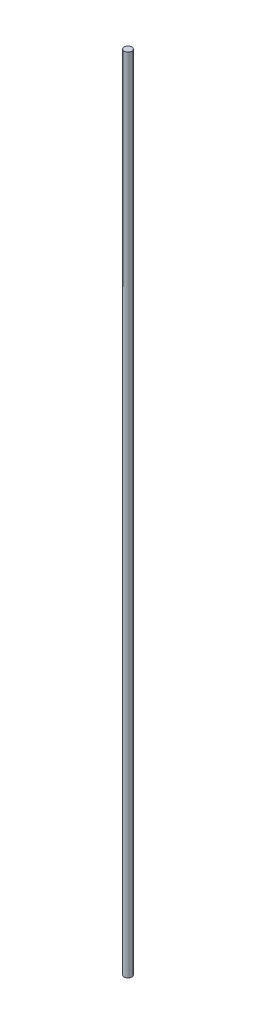
ISO-10303-21;
HEADER;
FILE_DESCRIPTION(('STEP AP214'),'2;1');
FILE_NAME('part.step','',(''),(''),'','','');
FILE_SCHEMA(('AUTOMOTIVE_DESIGN { 1 0 10303 214 1 1 1 1 }'));
ENDSEC;
DATA;
#1=APPLICATION_CONTEXT('core data for automotive mechanical design processes');
#2=APPLICATION_PROTOCOL_DEFINITION('international standard','automotive_design',2000,#1);
#3=PRODUCT_CONTEXT('',#1,'mechanical');
#4=PRODUCT('Part','Part','',(#3));
#5=PRODUCT_RELATED_PRODUCT_CATEGORY('part','',(#4));
#6=PRODUCT_DEFINITION_FORMATION('','',#4);
#7=PRODUCT_DEFINITION_CONTEXT('part definition',#1,'design');
#8=PRODUCT_DEFINITION('design','',#6,#7);
#9=PRODUCT_DEFINITION_SHAPE('','',#8);
#10=(LENGTH_UNIT() NAMED_UNIT(*) SI_UNIT(.MILLI.,.METRE.));
#11=(NAMED_UNIT(*) PLANE_ANGLE_UNIT() SI_UNIT($,.RADIAN.));
#12=(NAMED_UNIT(*) SI_UNIT($,.STERADIAN.) SOLID_ANGLE_UNIT());
#13=UNCERTAINTY_MEASURE_WITH_UNIT(LENGTH_MEASURE(1.E-05),#10,'distance_accuracy_value','');
#14=(GEOMETRIC_REPRESENTATION_CONTEXT(3) GLOBAL_UNCERTAINTY_ASSIGNED_CONTEXT((#13)) GLOBAL_UNIT_ASSIGNED_CONTEXT((#10,
#11,#12)) REPRESENTATION_CONTEXT('',''));
#15=CARTESIAN_POINT('',(0.,0.,0.));
#16=DIRECTION('',(0.,0.,1.));
#17=DIRECTION('',(1.,0.,0.));
#18=AXIS2_PLACEMENT_3D('',#15,#16,#17);
#19=CARTESIAN_POINT('',(-2.5,350.022255488333,0.));
#20=DIRECTION('',(0.,1.,0.));
#21=DIRECTION('',(-1.,0.,0.));
#22=AXIS2_PLACEMENT_3D('',#19,#20,#21);
#23=CYLINDRICAL_SURFACE('',#22,2.49999999999999);
#24=CARTESIAN_POINT('',(-2.5,350.022255488333,0.));
#25=DIRECTION('',(0.,1.,0.));
#26=DIRECTION('',(-1.,0.,0.));
#27=AXIS2_PLACEMENT_3D('',#24,#25,#26);
#28=CIRCLE('',#27,2.5);
#29=CARTESIAN_POINT('',(-5.,350.022255488333,0.));
#30=VERTEX_POINT('',#29);
#31=EDGE_CURVE('E10',#30,#30,#28,.T.);
#32=ORIENTED_EDGE('',*,*,#31,.F.);
#33=EDGE_LOOP('',(#32));
#34=FACE_BOUND('',#33,.T.);
#35=CARTESIAN_POINT('',(-2.49999999999994,-179.377744511665,0.));
#36=DIRECTION('',(0.,1.,0.));
#37=DIRECTION('',(-1.,0.,0.));
#38=AXIS2_PLACEMENT_3D('',#35,#36,#37);
#39=CIRCLE('',#38,2.49999999999998);
#40=CARTESIAN_POINT('',(-4.99999999999991,-179.377744511665,0.));
#41=VERTEX_POINT('',#40);
#42=EDGE_CURVE('E43',#41,#41,#39,.T.);
#43=ORIENTED_EDGE('',*,*,#42,.T.);
#44=EDGE_LOOP('',(#43));
#45=FACE_BOUND('',#44,.T.);
#46=ADVANCED_FACE('F37',(#34,#45),#23,.T.);
#47=CARTESIAN_POINT('',(-2.5,350.022255488333,0.));
#48=DIRECTION('',(0.,-1.,0.));
#49=DIRECTION('',(1.,0.,0.));
#50=AXIS2_PLACEMENT_3D('',#47,#48,#49);
#51=PLANE('',#50);
#52=ORIENTED_EDGE('',*,*,#31,.T.);
#53=EDGE_LOOP('',(#52));
#54=FACE_BOUND('',#53,.T.);
#55=ADVANCED_FACE('F52',(#54),#51,.F.);
#56=CARTESIAN_POINT('',(-2.49999999999994,-179.377744511665,0.));
#57=DIRECTION('',(0.,1.,0.));
#58=DIRECTION('',(-1.,0.,0.));
#59=AXIS2_PLACEMENT_3D('',#56,#57,#58);
#60=PLANE('',#59);
#61=ORIENTED_EDGE('',*,*,#42,.F.);
#62=EDGE_LOOP('',(#61));
#63=FACE_BOUND('',#62,.T.);
#64=ADVANCED_FACE('F50',(#63),#60,.F.);
#65=CLOSED_SHELL('',(#46,#55,#64));
#66=MANIFOLD_SOLID_BREP('B2',#65);
#67=ADVANCED_BREP_SHAPE_REPRESENTATION('',(#18,#66),#14);
#68=SHAPE_DEFINITION_REPRESENTATION(#9,#67);
ENDSEC;
END-ISO-10303-21;
